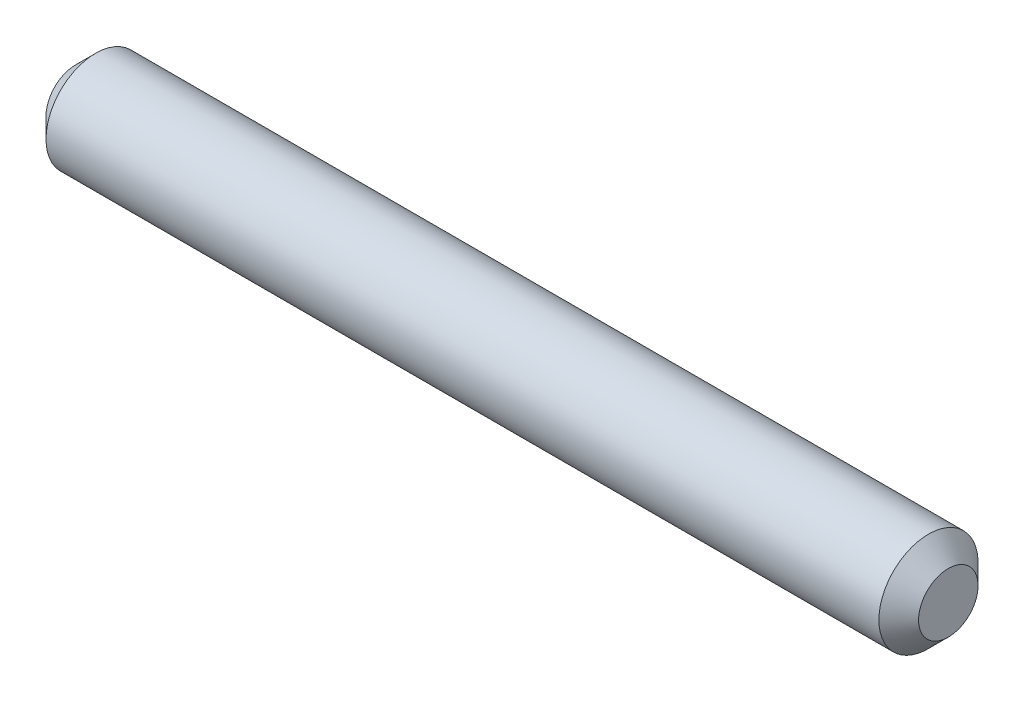
ISO-10303-21;
HEADER;
FILE_DESCRIPTION(('STEP AP214'),'2;1');
FILE_NAME('part.step','',(''),(''),'','','');
FILE_SCHEMA(('AUTOMOTIVE_DESIGN { 1 0 10303 214 1 1 1 1 }'));
ENDSEC;
DATA;
#1=APPLICATION_CONTEXT('core data for automotive mechanical design processes');
#2=APPLICATION_PROTOCOL_DEFINITION('international standard','automotive_design',2000,#1);
#3=PRODUCT_CONTEXT('',#1,'mechanical');
#4=PRODUCT('Part','Part','',(#3));
#5=PRODUCT_RELATED_PRODUCT_CATEGORY('part','',(#4));
#6=PRODUCT_DEFINITION_FORMATION('','',#4);
#7=PRODUCT_DEFINITION_CONTEXT('part definition',#1,'design');
#8=PRODUCT_DEFINITION('design','',#6,#7);
#9=PRODUCT_DEFINITION_SHAPE('','',#8);
#10=(LENGTH_UNIT() NAMED_UNIT(*) SI_UNIT(.MILLI.,.METRE.));
#11=(NAMED_UNIT(*) PLANE_ANGLE_UNIT() SI_UNIT($,.RADIAN.));
#12=(NAMED_UNIT(*) SI_UNIT($,.STERADIAN.) SOLID_ANGLE_UNIT());
#13=UNCERTAINTY_MEASURE_WITH_UNIT(LENGTH_MEASURE(1.E-05),#10,'distance_accuracy_value','');
#14=(GEOMETRIC_REPRESENTATION_CONTEXT(3) GLOBAL_UNCERTAINTY_ASSIGNED_CONTEXT((#13)) GLOBAL_UNIT_ASSIGNED_CONTEXT((#10,
#11,#12)) REPRESENTATION_CONTEXT('',''));
#15=CARTESIAN_POINT('',(0.,0.,0.));
#16=DIRECTION('',(0.,0.,1.));
#17=DIRECTION('',(1.,0.,0.));
#18=AXIS2_PLACEMENT_3D('',#15,#16,#17);
#19=CARTESIAN_POINT('',(0.,0.,0.));
#20=DIRECTION('',(1.,0.,0.));
#21=DIRECTION('',(0.,0.,-1.));
#22=AXIS2_PLACEMENT_3D('',#19,#20,#21);
#23=PLANE('',#22);
#24=CARTESIAN_POINT('',(0.,0.,0.));
#25=DIRECTION('',(-1.,0.,0.));
#26=DIRECTION('',(0.,0.,1.));
#27=AXIS2_PLACEMENT_3D('',#24,#25,#26);
#28=CIRCLE('',#27,1.5);
#29=CARTESIAN_POINT('',(0.,0.,1.5));
#30=VERTEX_POINT('',#29);
#31=EDGE_CURVE('E10',#30,#30,#28,.T.);
#32=ORIENTED_EDGE('',*,*,#31,.T.);
#33=EDGE_LOOP('',(#32));
#34=FACE_BOUND('',#33,.T.);
#35=ADVANCED_FACE('F41',(#34),#23,.F.);
#36=CARTESIAN_POINT('',(1.,0.,0.));
#37=DIRECTION('',(1.,0.,0.));
#38=DIRECTION('',(0.,0.,-1.));
#39=AXIS2_PLACEMENT_3D('',#36,#37,#38);
#40=CONICAL_SURFACE('',#39,2.5,0.785398163397448);
#41=ORIENTED_EDGE('',*,*,#31,.F.);
#42=EDGE_LOOP('',(#41));
#43=FACE_BOUND('',#42,.T.);
#44=CARTESIAN_POINT('',(1.,0.,0.));
#45=DIRECTION('',(-1.,0.,0.));
#46=DIRECTION('',(0.,0.,1.));
#47=AXIS2_PLACEMENT_3D('',#44,#45,#46);
#48=CIRCLE('',#47,2.5);
#49=CARTESIAN_POINT('',(1.,0.,2.5));
#50=VERTEX_POINT('',#49);
#51=EDGE_CURVE('E48',#50,#50,#48,.T.);
#52=ORIENTED_EDGE('',*,*,#51,.T.);
#53=EDGE_LOOP('',(#52));
#54=FACE_BOUND('',#53,.T.);
#55=ADVANCED_FACE('F77',(#43,#54),#40,.T.);
#56=CARTESIAN_POINT('',(0.,0.,0.));
#57=DIRECTION('',(-1.,0.,0.));
#58=DIRECTION('',(0.,0.,1.));
#59=AXIS2_PLACEMENT_3D('',#56,#57,#58);
#60=CYLINDRICAL_SURFACE('',#59,2.5);
#61=ORIENTED_EDGE('',*,*,#51,.F.);
#62=EDGE_LOOP('',(#61));
#63=FACE_BOUND('',#62,.T.);
#64=CARTESIAN_POINT('',(43.,0.,0.));
#65=DIRECTION('',(-1.,0.,0.));
#66=DIRECTION('',(0.,0.,1.));
#67=AXIS2_PLACEMENT_3D('',#64,#65,#66);
#68=CIRCLE('',#67,2.5);
#69=CARTESIAN_POINT('',(43.,0.,2.5));
#70=VERTEX_POINT('',#69);
#71=EDGE_CURVE('E53',#70,#70,#68,.T.);
#72=ORIENTED_EDGE('',*,*,#71,.T.);
#73=EDGE_LOOP('',(#72));
#74=FACE_BOUND('',#73,.T.);
#75=ADVANCED_FACE('F73',(#63,#74),#60,.T.);
#76=CARTESIAN_POINT('',(44.,0.,0.));
#77=DIRECTION('',(-1.,0.,0.));
#78=DIRECTION('',(0.,0.,1.));
#79=AXIS2_PLACEMENT_3D('',#76,#77,#78);
#80=CONICAL_SURFACE('',#79,1.5,0.785398163397448);
#81=ORIENTED_EDGE('',*,*,#71,.F.);
#82=EDGE_LOOP('',(#81));
#83=FACE_BOUND('',#82,.T.);
#84=CARTESIAN_POINT('',(44.,0.,0.));
#85=DIRECTION('',(-1.,0.,0.));
#86=DIRECTION('',(0.,0.,1.));
#87=AXIS2_PLACEMENT_3D('',#84,#85,#86);
#88=CIRCLE('',#87,1.5);
#89=CARTESIAN_POINT('',(44.,0.,1.5));
#90=VERTEX_POINT('',#89);
#91=EDGE_CURVE('E58',#90,#90,#88,.T.);
#92=ORIENTED_EDGE('',*,*,#91,.T.);
#93=EDGE_LOOP('',(#92));
#94=FACE_BOUND('',#93,.T.);
#95=ADVANCED_FACE('F65',(#83,#94),#80,.T.);
#96=CARTESIAN_POINT('',(44.,0.,0.));
#97=DIRECTION('',(-1.,0.,0.));
#98=DIRECTION('',(0.,0.,1.));
#99=AXIS2_PLACEMENT_3D('',#96,#97,#98);
#100=PLANE('',#99);
#101=ORIENTED_EDGE('',*,*,#91,.F.);
#102=EDGE_LOOP('',(#101));
#103=FACE_BOUND('',#102,.T.);
#104=ADVANCED_FACE('F67',(#103),#100,.F.);
#105=CLOSED_SHELL('',(#35,#55,#75,#95,#104));
#106=MANIFOLD_SOLID_BREP('B2',#105);
#107=ADVANCED_BREP_SHAPE_REPRESENTATION('',(#18,#106),#14);
#108=SHAPE_DEFINITION_REPRESENTATION(#9,#107);
ENDSEC;
END-ISO-10303-21;
